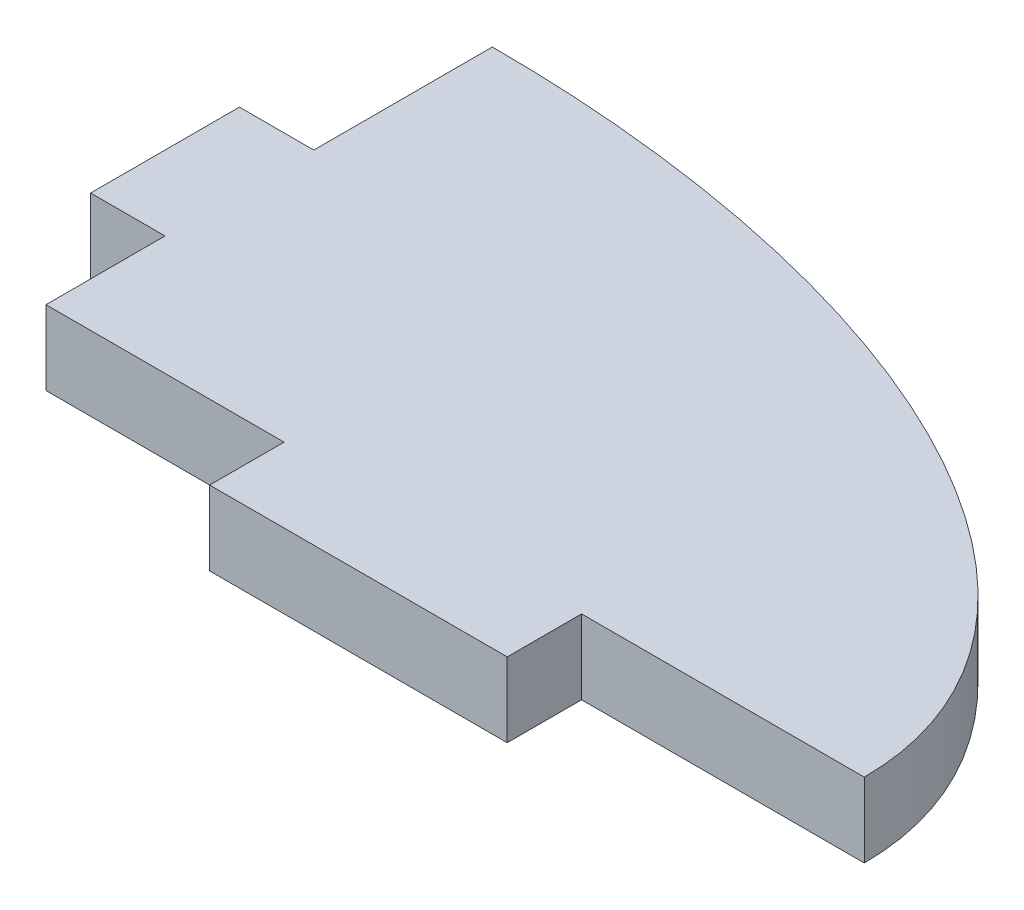
ISO-10303-21;
HEADER;
FILE_DESCRIPTION(('STEP AP214'),'2;1');
FILE_NAME('part.step','',(''),(''),'','','');
FILE_SCHEMA(('AUTOMOTIVE_DESIGN { 1 0 10303 214 1 1 1 1 }'));
ENDSEC;
DATA;
#1=APPLICATION_CONTEXT('core data for automotive mechanical design processes');
#2=APPLICATION_PROTOCOL_DEFINITION('international standard','automotive_design',2000,#1);
#3=PRODUCT_CONTEXT('',#1,'mechanical');
#4=PRODUCT('Part','Part','',(#3));
#5=PRODUCT_RELATED_PRODUCT_CATEGORY('part','',(#4));
#6=PRODUCT_DEFINITION_FORMATION('','',#4);
#7=PRODUCT_DEFINITION_CONTEXT('part definition',#1,'design');
#8=PRODUCT_DEFINITION('design','',#6,#7);
#9=PRODUCT_DEFINITION_SHAPE('','',#8);
#10=(LENGTH_UNIT() NAMED_UNIT(*) SI_UNIT(.MILLI.,.METRE.));
#11=(NAMED_UNIT(*) PLANE_ANGLE_UNIT() SI_UNIT($,.RADIAN.));
#12=(NAMED_UNIT(*) SI_UNIT($,.STERADIAN.) SOLID_ANGLE_UNIT());
#13=UNCERTAINTY_MEASURE_WITH_UNIT(LENGTH_MEASURE(1.E-05),#10,'distance_accuracy_value','');
#14=(GEOMETRIC_REPRESENTATION_CONTEXT(3) GLOBAL_UNCERTAINTY_ASSIGNED_CONTEXT((#13)) GLOBAL_UNIT_ASSIGNED_CONTEXT((#10,
#11,#12)) REPRESENTATION_CONTEXT('',''));
#15=CARTESIAN_POINT('',(0.,0.,0.));
#16=DIRECTION('',(0.,0.,1.));
#17=DIRECTION('',(1.,0.,0.));
#18=AXIS2_PLACEMENT_3D('',#15,#16,#17);
#19=CARTESIAN_POINT('',(0.,3.175,0.));
#20=DIRECTION('',(0.,0.,-1.));
#21=DIRECTION('',(-1.,0.,0.));
#22=AXIS2_PLACEMENT_3D('',#19,#20,#21);
#23=PLANE('',#22);
#24=DIRECTION('',(1.,0.,0.));
#25=VECTOR('',#24,1.);
#26=CARTESIAN_POINT('',(0.,0.,0.));
#27=LINE('',#26,#25);
#28=CARTESIAN_POINT('',(0.,0.,0.));
#29=VERTEX_POINT('',#28);
#30=CARTESIAN_POINT('',(10.16,0.,0.));
#31=VERTEX_POINT('',#30);
#32=EDGE_CURVE('E349',#29,#31,#27,.T.);
#33=ORIENTED_EDGE('',*,*,#32,.T.);
#34=DIRECTION('',(0.,1.,0.));
#35=VECTOR('',#34,1.);
#36=CARTESIAN_POINT('',(10.16,0.,0.));
#37=LINE('',#36,#35);
#38=CARTESIAN_POINT('',(10.16,3.175,0.));
#39=VERTEX_POINT('',#38);
#40=EDGE_CURVE('E60',#31,#39,#37,.T.);
#41=ORIENTED_EDGE('',*,*,#40,.T.);
#42=DIRECTION('',(1.,0.,0.));
#43=VECTOR('',#42,1.);
#44=CARTESIAN_POINT('',(0.,3.175,0.));
#45=LINE('',#44,#43);
#46=CARTESIAN_POINT('',(0.,3.175,0.));
#47=VERTEX_POINT('',#46);
#48=EDGE_CURVE('E185',#47,#39,#45,.T.);
#49=ORIENTED_EDGE('',*,*,#48,.F.);
#50=DIRECTION('',(0.,-1.,0.));
#51=VECTOR('',#50,1.);
#52=CARTESIAN_POINT('',(0.,3.175,0.));
#53=LINE('',#52,#51);
#54=EDGE_CURVE('E351',#47,#29,#53,.T.);
#55=ORIENTED_EDGE('',*,*,#54,.T.);
#56=EDGE_LOOP('',(#33,#41,#49,#55));
#57=FACE_BOUND('',#56,.T.);
#58=ADVANCED_FACE('F37',(#57),#23,.F.);
#59=CARTESIAN_POINT('',(0.,3.175,0.));
#60=DIRECTION('',(1.,0.,0.));
#61=DIRECTION('',(0.,0.,-1.));
#62=AXIS2_PLACEMENT_3D('',#59,#60,#61);
#63=PLANE('',#62);
#64=DIRECTION('',(0.,0.,1.));
#65=VECTOR('',#64,1.);
#66=CARTESIAN_POINT('',(0.,3.175,0.));
#67=LINE('',#66,#65);
#68=CARTESIAN_POINT('',(0.,3.175,-5.08));
#69=VERTEX_POINT('',#68);
#70=EDGE_CURVE('E190',#69,#47,#67,.T.);
#71=ORIENTED_EDGE('',*,*,#70,.F.);
#72=DIRECTION('',(0.,1.,0.));
#73=VECTOR('',#72,1.);
#74=CARTESIAN_POINT('',(0.,0.,-5.08));
#75=LINE('',#74,#73);
#76=CARTESIAN_POINT('',(0.,0.,-5.08));
#77=VERTEX_POINT('',#76);
#78=EDGE_CURVE('E176',#77,#69,#75,.T.);
#79=ORIENTED_EDGE('',*,*,#78,.F.);
#80=DIRECTION('',(0.,0.,1.));
#81=VECTOR('',#80,1.);
#82=CARTESIAN_POINT('',(0.,0.,0.));
#83=LINE('',#82,#81);
#84=EDGE_CURVE('E353',#77,#29,#83,.T.);
#85=ORIENTED_EDGE('',*,*,#84,.T.);
#86=ORIENTED_EDGE('',*,*,#54,.F.);
#87=EDGE_LOOP('',(#71,#79,#85,#86));
#88=FACE_BOUND('',#87,.T.);
#89=ADVANCED_FACE('F202',(#88),#63,.F.);
#90=CARTESIAN_POINT('',(22.86,3.175,0.));
#91=VERTEX_POINT('',#90);
#92=CARTESIAN_POINT('',(34.925,3.175,0.));
#93=VERTEX_POINT('',#92);
#94=EDGE_CURVE('E52',#91,#93,#45,.T.);
#95=ORIENTED_EDGE('',*,*,#94,.F.);
#96=DIRECTION('',(0.,1.,0.));
#97=VECTOR('',#96,1.);
#98=CARTESIAN_POINT('',(22.86,0.,0.));
#99=LINE('',#98,#97);
#100=CARTESIAN_POINT('',(22.86,0.,0.));
#101=VERTEX_POINT('',#100);
#102=EDGE_CURVE('E155',#101,#91,#99,.T.);
#103=ORIENTED_EDGE('',*,*,#102,.F.);
#104=CARTESIAN_POINT('',(34.925,0.,0.));
#105=VERTEX_POINT('',#104);
#106=EDGE_CURVE('E179',#101,#105,#27,.T.);
#107=ORIENTED_EDGE('',*,*,#106,.T.);
#108=DIRECTION('',(0.,-1.,0.));
#109=VECTOR('',#108,1.);
#110=CARTESIAN_POINT('',(34.925,3.175,0.));
#111=LINE('',#110,#109);
#112=EDGE_CURVE('E11',#93,#105,#111,.T.);
#113=ORIENTED_EDGE('',*,*,#112,.F.);
#114=EDGE_LOOP('',(#95,#103,#107,#113));
#115=FACE_BOUND('',#114,.T.);
#116=ADVANCED_FACE('F39',(#115),#23,.F.);
#117=CARTESIAN_POINT('',(0.,3.175,0.));
#118=DIRECTION('',(0.,1.,0.));
#119=DIRECTION('',(-1.,0.,0.));
#120=AXIS2_PLACEMENT_3D('',#117,#118,#119);
#121=ELLIPSE('',#120,34.925,19.05);
#122=DIRECTION('',(0.,-1.,0.));
#123=VECTOR('',#122,1.);
#124=SURFACE_OF_LINEAR_EXTRUSION('',#121,#123);
#125=CARTESIAN_POINT('',(0.,0.,0.));
#126=DIRECTION('',(0.,1.,0.));
#127=DIRECTION('',(-1.,0.,0.));
#128=AXIS2_PLACEMENT_3D('',#125,#126,#127);
#129=ELLIPSE('',#128,34.925,19.05);
#130=CARTESIAN_POINT('',(0.,0.,-19.05));
#131=VERTEX_POINT('',#130);
#132=EDGE_CURVE('E352',#105,#131,#129,.T.);
#133=ORIENTED_EDGE('',*,*,#132,.T.);
#134=DIRECTION('',(0.,-1.,0.));
#135=VECTOR('',#134,1.);
#136=CARTESIAN_POINT('',(0.,3.175,-19.05));
#137=LINE('',#136,#135);
#138=CARTESIAN_POINT('',(0.,3.175,-19.05));
#139=VERTEX_POINT('',#138);
#140=EDGE_CURVE('E45',#139,#131,#137,.T.);
#141=ORIENTED_EDGE('',*,*,#140,.F.);
#142=EDGE_CURVE('E187',#93,#139,#121,.T.);
#143=ORIENTED_EDGE('',*,*,#142,.F.);
#144=ORIENTED_EDGE('',*,*,#112,.T.);
#145=EDGE_LOOP('',(#133,#141,#143,#144));
#146=FACE_BOUND('',#145,.T.);
#147=ADVANCED_FACE('F193',(#146),#124,.F.);
#148=CARTESIAN_POINT('',(0.,0.,-11.43));
#149=VERTEX_POINT('',#148);
#150=EDGE_CURVE('E356',#131,#149,#83,.T.);
#151=ORIENTED_EDGE('',*,*,#150,.T.);
#152=DIRECTION('',(0.,1.,0.));
#153=VECTOR('',#152,1.);
#154=CARTESIAN_POINT('',(0.,0.,-11.43));
#155=LINE('',#154,#153);
#156=CARTESIAN_POINT('',(0.,3.175,-11.43));
#157=VERTEX_POINT('',#156);
#158=EDGE_CURVE('E168',#149,#157,#155,.T.);
#159=ORIENTED_EDGE('',*,*,#158,.T.);
#160=EDGE_CURVE('E191',#139,#157,#67,.T.);
#161=ORIENTED_EDGE('',*,*,#160,.F.);
#162=ORIENTED_EDGE('',*,*,#140,.T.);
#163=EDGE_LOOP('',(#151,#159,#161,#162));
#164=FACE_BOUND('',#163,.T.);
#165=ADVANCED_FACE('F196',(#164),#63,.F.);
#166=CARTESIAN_POINT('',(0.,3.175,0.));
#167=DIRECTION('',(0.,1.,0.));
#168=DIRECTION('',(0.,0.,1.));
#169=AXIS2_PLACEMENT_3D('',#166,#167,#168);
#170=PLANE('',#169);
#171=ORIENTED_EDGE('',*,*,#48,.T.);
#172=DIRECTION('',(0.,0.,1.));
#173=VECTOR('',#172,1.);
#174=CARTESIAN_POINT('',(10.16,3.175,0.));
#175=LINE('',#174,#173);
#176=CARTESIAN_POINT('',(10.16,3.175,3.175));
#177=VERTEX_POINT('',#176);
#178=EDGE_CURVE('E150',#39,#177,#175,.T.);
#179=ORIENTED_EDGE('',*,*,#178,.T.);
#180=DIRECTION('',(1.,0.,0.));
#181=VECTOR('',#180,1.);
#182=CARTESIAN_POINT('',(10.16,3.175,3.175));
#183=LINE('',#182,#181);
#184=CARTESIAN_POINT('',(22.86,3.175,3.175));
#185=VERTEX_POINT('',#184);
#186=EDGE_CURVE('E127',#177,#185,#183,.T.);
#187=ORIENTED_EDGE('',*,*,#186,.T.);
#188=DIRECTION('',(0.,0.,-1.));
#189=VECTOR('',#188,1.);
#190=CARTESIAN_POINT('',(22.86,3.175,0.));
#191=LINE('',#190,#189);
#192=EDGE_CURVE('E144',#185,#91,#191,.T.);
#193=ORIENTED_EDGE('',*,*,#192,.T.);
#194=ORIENTED_EDGE('',*,*,#94,.T.);
#195=ORIENTED_EDGE('',*,*,#142,.T.);
#196=ORIENTED_EDGE('',*,*,#160,.T.);
#197=DIRECTION('',(-1.,0.,0.));
#198=VECTOR('',#197,1.);
#199=CARTESIAN_POINT('',(0.,3.175,-11.43));
#200=LINE('',#199,#198);
#201=CARTESIAN_POINT('',(-3.175,3.175,-11.43));
#202=VERTEX_POINT('',#201);
#203=EDGE_CURVE('E154',#157,#202,#200,.T.);
#204=ORIENTED_EDGE('',*,*,#203,.T.);
#205=DIRECTION('',(0.,0.,1.));
#206=VECTOR('',#205,1.);
#207=CARTESIAN_POINT('',(-3.175,3.175,-5.08));
#208=LINE('',#207,#206);
#209=CARTESIAN_POINT('',(-3.175,3.175,-5.08));
#210=VERTEX_POINT('',#209);
#211=EDGE_CURVE('E171',#202,#210,#208,.T.);
#212=ORIENTED_EDGE('',*,*,#211,.T.);
#213=DIRECTION('',(1.,0.,0.));
#214=VECTOR('',#213,1.);
#215=CARTESIAN_POINT('',(0.,3.175,-5.08));
#216=LINE('',#215,#214);
#217=EDGE_CURVE('E162',#210,#69,#216,.T.);
#218=ORIENTED_EDGE('',*,*,#217,.T.);
#219=ORIENTED_EDGE('',*,*,#70,.T.);
#220=EDGE_LOOP('',(#171,#179,#187,#193,#194,#195,#196,#204,#212,#218,#219));
#221=FACE_BOUND('',#220,.T.);
#222=ADVANCED_FACE('F200',(#221),#170,.T.);
#223=CARTESIAN_POINT('',(0.,0.,0.));
#224=DIRECTION('',(0.,1.,0.));
#225=DIRECTION('',(0.,0.,1.));
#226=AXIS2_PLACEMENT_3D('',#223,#224,#225);
#227=PLANE('',#226);
#228=ORIENTED_EDGE('',*,*,#32,.F.);
#229=ORIENTED_EDGE('',*,*,#84,.F.);
#230=DIRECTION('',(1.,0.,0.));
#231=VECTOR('',#230,1.);
#232=CARTESIAN_POINT('',(0.,0.,-5.08));
#233=LINE('',#232,#231);
#234=CARTESIAN_POINT('',(-3.175,0.,-5.08));
#235=VERTEX_POINT('',#234);
#236=EDGE_CURVE('E165',#235,#77,#233,.T.);
#237=ORIENTED_EDGE('',*,*,#236,.F.);
#238=DIRECTION('',(0.,0.,1.));
#239=VECTOR('',#238,1.);
#240=CARTESIAN_POINT('',(-3.175,0.,-5.08));
#241=LINE('',#240,#239);
#242=CARTESIAN_POINT('',(-3.175,0.,-11.43));
#243=VERTEX_POINT('',#242);
#244=EDGE_CURVE('E161',#243,#235,#241,.T.);
#245=ORIENTED_EDGE('',*,*,#244,.F.);
#246=DIRECTION('',(-1.,0.,0.));
#247=VECTOR('',#246,1.);
#248=CARTESIAN_POINT('',(0.,0.,-11.43));
#249=LINE('',#248,#247);
#250=EDGE_CURVE('E158',#149,#243,#249,.T.);
#251=ORIENTED_EDGE('',*,*,#250,.F.);
#252=ORIENTED_EDGE('',*,*,#150,.F.);
#253=ORIENTED_EDGE('',*,*,#132,.F.);
#254=ORIENTED_EDGE('',*,*,#106,.F.);
#255=DIRECTION('',(0.,0.,-1.));
#256=VECTOR('',#255,1.);
#257=CARTESIAN_POINT('',(22.86,0.,0.));
#258=LINE('',#257,#256);
#259=CARTESIAN_POINT('',(22.86,0.,3.175));
#260=VERTEX_POINT('',#259);
#261=EDGE_CURVE('E133',#260,#101,#258,.T.);
#262=ORIENTED_EDGE('',*,*,#261,.F.);
#263=DIRECTION('',(1.,0.,0.));
#264=VECTOR('',#263,1.);
#265=CARTESIAN_POINT('',(10.16,0.,3.175));
#266=LINE('',#265,#264);
#267=CARTESIAN_POINT('',(10.16,0.,3.175));
#268=VERTEX_POINT('',#267);
#269=EDGE_CURVE('E125',#268,#260,#266,.T.);
#270=ORIENTED_EDGE('',*,*,#269,.F.);
#271=DIRECTION('',(0.,0.,1.));
#272=VECTOR('',#271,1.);
#273=CARTESIAN_POINT('',(10.16,0.,0.));
#274=LINE('',#273,#272);
#275=EDGE_CURVE('E140',#31,#268,#274,.T.);
#276=ORIENTED_EDGE('',*,*,#275,.F.);
#277=EDGE_LOOP('',(#228,#229,#237,#245,#251,#252,#253,#254,#262,#270,#276));
#278=FACE_BOUND('',#277,.T.);
#279=ADVANCED_FACE('F139',(#278),#227,.F.);
#280=CARTESIAN_POINT('',(0.,0.,-5.08));
#281=DIRECTION('',(0.,0.,1.));
#282=DIRECTION('',(1.,0.,0.));
#283=AXIS2_PLACEMENT_3D('',#280,#281,#282);
#284=PLANE('',#283);
#285=ORIENTED_EDGE('',*,*,#217,.F.);
#286=DIRECTION('',(0.,1.,0.));
#287=VECTOR('',#286,1.);
#288=CARTESIAN_POINT('',(-3.175,0.,-5.08));
#289=LINE('',#288,#287);
#290=EDGE_CURVE('E180',#235,#210,#289,.T.);
#291=ORIENTED_EDGE('',*,*,#290,.F.);
#292=ORIENTED_EDGE('',*,*,#236,.T.);
#293=ORIENTED_EDGE('',*,*,#78,.T.);
#294=EDGE_LOOP('',(#285,#291,#292,#293));
#295=FACE_BOUND('',#294,.T.);
#296=ADVANCED_FACE('F205',(#295),#284,.T.);
#297=CARTESIAN_POINT('',(-3.175,0.,-5.08));
#298=DIRECTION('',(-1.,0.,0.));
#299=DIRECTION('',(0.,0.,1.));
#300=AXIS2_PLACEMENT_3D('',#297,#298,#299);
#301=PLANE('',#300);
#302=ORIENTED_EDGE('',*,*,#211,.F.);
#303=DIRECTION('',(0.,1.,0.));
#304=VECTOR('',#303,1.);
#305=CARTESIAN_POINT('',(-3.175,0.,-11.43));
#306=LINE('',#305,#304);
#307=EDGE_CURVE('E182',#243,#202,#306,.T.);
#308=ORIENTED_EDGE('',*,*,#307,.F.);
#309=ORIENTED_EDGE('',*,*,#244,.T.);
#310=ORIENTED_EDGE('',*,*,#290,.T.);
#311=EDGE_LOOP('',(#302,#308,#309,#310));
#312=FACE_BOUND('',#311,.T.);
#313=ADVANCED_FACE('F212',(#312),#301,.T.);
#314=CARTESIAN_POINT('',(0.,0.,-11.43));
#315=DIRECTION('',(0.,0.,-1.));
#316=DIRECTION('',(-1.,0.,0.));
#317=AXIS2_PLACEMENT_3D('',#314,#315,#316);
#318=PLANE('',#317);
#319=ORIENTED_EDGE('',*,*,#203,.F.);
#320=ORIENTED_EDGE('',*,*,#158,.F.);
#321=ORIENTED_EDGE('',*,*,#250,.T.);
#322=ORIENTED_EDGE('',*,*,#307,.T.);
#323=EDGE_LOOP('',(#319,#320,#321,#322));
#324=FACE_BOUND('',#323,.T.);
#325=ADVANCED_FACE('F209',(#324),#318,.T.);
#326=CARTESIAN_POINT('',(10.16,0.,0.));
#327=DIRECTION('',(-1.,0.,0.));
#328=DIRECTION('',(0.,0.,1.));
#329=AXIS2_PLACEMENT_3D('',#326,#327,#328);
#330=PLANE('',#329);
#331=ORIENTED_EDGE('',*,*,#178,.F.);
#332=ORIENTED_EDGE('',*,*,#40,.F.);
#333=ORIENTED_EDGE('',*,*,#275,.T.);
#334=DIRECTION('',(0.,1.,0.));
#335=VECTOR('',#334,1.);
#336=CARTESIAN_POINT('',(10.16,0.,3.175));
#337=LINE('',#336,#335);
#338=EDGE_CURVE('E122',#268,#177,#337,.T.);
#339=ORIENTED_EDGE('',*,*,#338,.T.);
#340=EDGE_LOOP('',(#331,#332,#333,#339));
#341=FACE_BOUND('',#340,.T.);
#342=ADVANCED_FACE('F143',(#341),#330,.T.);
#343=CARTESIAN_POINT('',(22.86,0.,0.));
#344=DIRECTION('',(1.,0.,0.));
#345=DIRECTION('',(0.,0.,-1.));
#346=AXIS2_PLACEMENT_3D('',#343,#344,#345);
#347=PLANE('',#346);
#348=ORIENTED_EDGE('',*,*,#192,.F.);
#349=DIRECTION('',(0.,1.,0.));
#350=VECTOR('',#349,1.);
#351=CARTESIAN_POINT('',(22.86,0.,3.175));
#352=LINE('',#351,#350);
#353=EDGE_CURVE('E132',#260,#185,#352,.T.);
#354=ORIENTED_EDGE('',*,*,#353,.F.);
#355=ORIENTED_EDGE('',*,*,#261,.T.);
#356=ORIENTED_EDGE('',*,*,#102,.T.);
#357=EDGE_LOOP('',(#348,#354,#355,#356));
#358=FACE_BOUND('',#357,.T.);
#359=ADVANCED_FACE('F222',(#358),#347,.T.);
#360=CARTESIAN_POINT('',(10.16,0.,3.175));
#361=DIRECTION('',(0.,0.,1.));
#362=DIRECTION('',(1.,0.,0.));
#363=AXIS2_PLACEMENT_3D('',#360,#361,#362);
#364=PLANE('',#363);
#365=ORIENTED_EDGE('',*,*,#186,.F.);
#366=ORIENTED_EDGE('',*,*,#338,.F.);
#367=ORIENTED_EDGE('',*,*,#269,.T.);
#368=ORIENTED_EDGE('',*,*,#353,.T.);
#369=EDGE_LOOP('',(#365,#366,#367,#368));
#370=FACE_BOUND('',#369,.T.);
#371=ADVANCED_FACE('F124',(#370),#364,.T.);
#372=CLOSED_SHELL('',(#58,#89,#116,#147,#165,#222,#279,#296,#313,#325,#342,#359,#371));
#373=MANIFOLD_SOLID_BREP('B2',#372);
#374=ADVANCED_BREP_SHAPE_REPRESENTATION('',(#18,#373),#14);
#375=SHAPE_DEFINITION_REPRESENTATION(#9,#374);
ENDSEC;
END-ISO-10303-21;
